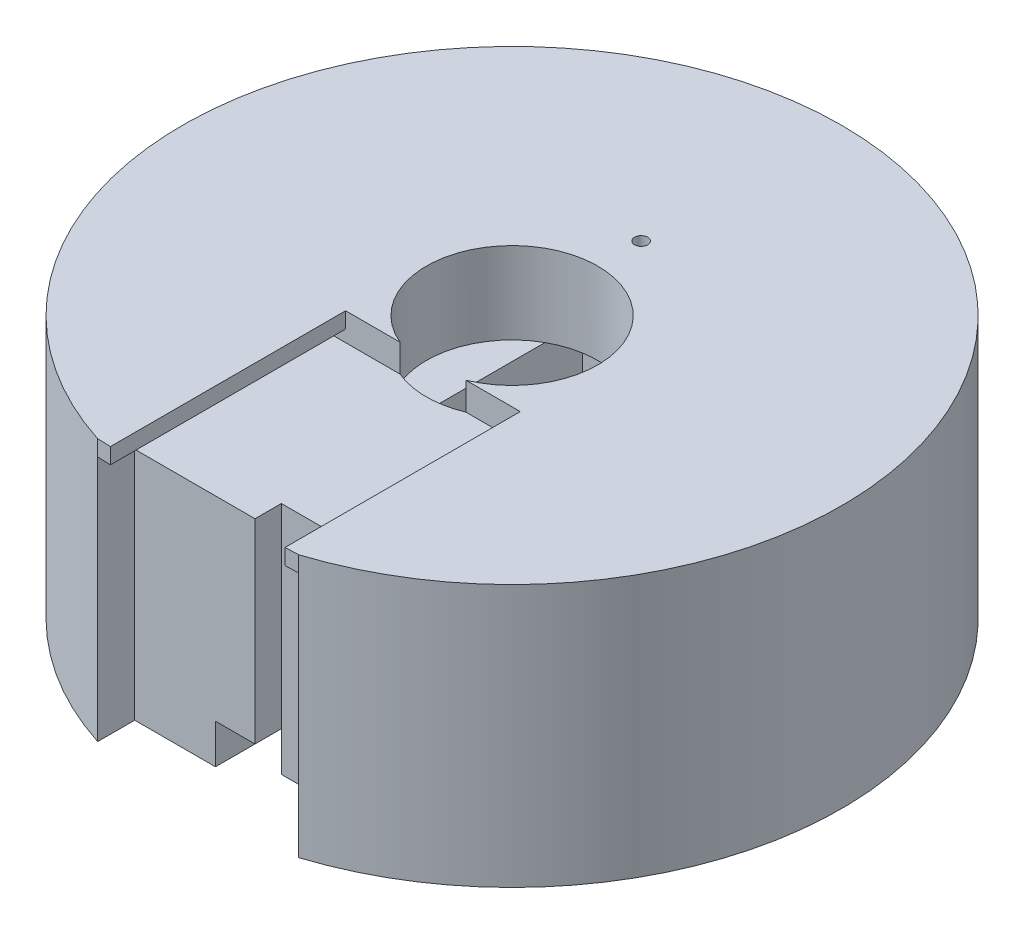
ISO-10303-21;
HEADER;
FILE_DESCRIPTION(('STEP AP214'),'2;1');
FILE_NAME('part.step','',(''),(''),'','','');
FILE_SCHEMA(('AUTOMOTIVE_DESIGN { 1 0 10303 214 1 1 1 1 }'));
ENDSEC;
DATA;
#1=APPLICATION_CONTEXT('core data for automotive mechanical design processes');
#2=APPLICATION_PROTOCOL_DEFINITION('international standard','automotive_design',2000,#1);
#3=PRODUCT_CONTEXT('',#1,'mechanical');
#4=PRODUCT('Part','Part','',(#3));
#5=PRODUCT_RELATED_PRODUCT_CATEGORY('part','',(#4));
#6=PRODUCT_DEFINITION_FORMATION('','',#4);
#7=PRODUCT_DEFINITION_CONTEXT('part definition',#1,'design');
#8=PRODUCT_DEFINITION('design','',#6,#7);
#9=PRODUCT_DEFINITION_SHAPE('','',#8);
#10=(LENGTH_UNIT() NAMED_UNIT(*) SI_UNIT(.MILLI.,.METRE.));
#11=(NAMED_UNIT(*) PLANE_ANGLE_UNIT() SI_UNIT($,.RADIAN.));
#12=(NAMED_UNIT(*) SI_UNIT($,.STERADIAN.) SOLID_ANGLE_UNIT());
#13=UNCERTAINTY_MEASURE_WITH_UNIT(LENGTH_MEASURE(1.E-05),#10,'distance_accuracy_value','');
#14=(GEOMETRIC_REPRESENTATION_CONTEXT(3) GLOBAL_UNCERTAINTY_ASSIGNED_CONTEXT((#13)) GLOBAL_UNIT_ASSIGNED_CONTEXT((#10,
#11,#12)) REPRESENTATION_CONTEXT('',''));
#15=CARTESIAN_POINT('',(0.,0.,0.));
#16=DIRECTION('',(0.,0.,1.));
#17=DIRECTION('',(1.,0.,0.));
#18=AXIS2_PLACEMENT_3D('',#15,#16,#17);
#19=CARTESIAN_POINT('',(15.25,67.1317300508551,50.));
#20=DIRECTION('',(1.,0.,0.));
#21=DIRECTION('',(0.,0.,-1.));
#22=AXIS2_PLACEMENT_3D('',#19,#20,#21);
#23=PLANE('',#22);
#24=DIRECTION('',(0.,0.,1.));
#25=VECTOR('',#24,1.);
#26=CARTESIAN_POINT('',(15.2500000000003,37.4,47.6176175380499));
#27=LINE('',#26,#25);
#28=CARTESIAN_POINT('',(15.25,37.4,12.));
#29=VERTEX_POINT('',#28);
#30=CARTESIAN_POINT('',(15.2500000000003,37.4,47.6176175380499));
#31=VERTEX_POINT('',#30);
#32=EDGE_CURVE('E243',#29,#31,#27,.T.);
#33=ORIENTED_EDGE('',*,*,#32,.F.);
#34=DIRECTION('',(0.,-1.,0.));
#35=VECTOR('',#34,1.);
#36=CARTESIAN_POINT('',(15.25,40.8,12.));
#37=LINE('',#36,#35);
#38=CARTESIAN_POINT('',(15.25,35.6,12.));
#39=VERTEX_POINT('',#38);
#40=EDGE_CURVE('E248',#29,#39,#37,.T.);
#41=ORIENTED_EDGE('',*,*,#40,.T.);
#42=DIRECTION('',(0.,0.,-1.));
#43=VECTOR('',#42,1.);
#44=CARTESIAN_POINT('',(15.25,35.6,0.));
#45=LINE('',#44,#43);
#46=CARTESIAN_POINT('',(15.25,35.6,38.));
#47=VERTEX_POINT('',#46);
#48=EDGE_CURVE('E52',#47,#39,#45,.T.);
#49=ORIENTED_EDGE('',*,*,#48,.F.);
#50=DIRECTION('',(0.,-1.,0.));
#51=VECTOR('',#50,1.);
#52=CARTESIAN_POINT('',(15.25,6.,38.));
#53=LINE('',#52,#51);
#54=CARTESIAN_POINT('',(15.25,0.,38.));
#55=VERTEX_POINT('',#54);
#56=EDGE_CURVE('E333',#47,#55,#53,.T.);
#57=ORIENTED_EDGE('',*,*,#56,.T.);
#58=DIRECTION('',(0.,0.,1.));
#59=VECTOR('',#58,1.);
#60=CARTESIAN_POINT('',(15.25,0.,50.));
#61=LINE('',#60,#59);
#62=CARTESIAN_POINT('',(15.25,0.,47.6176175380499));
#63=VERTEX_POINT('',#62);
#64=EDGE_CURVE('E342',#55,#63,#61,.T.);
#65=ORIENTED_EDGE('',*,*,#64,.T.);
#66=DIRECTION('',(0.,-1.,0.));
#67=VECTOR('',#66,1.);
#68=CARTESIAN_POINT('',(15.25,19.2,47.6176175380499));
#69=LINE('',#68,#67);
#70=EDGE_CURVE('E358',#31,#63,#69,.T.);
#71=ORIENTED_EDGE('',*,*,#70,.F.);
#72=EDGE_LOOP('',(#33,#41,#49,#57,#65,#71));
#73=FACE_BOUND('',#72,.T.);
#74=ADVANCED_FACE('F44',(#73),#23,.F.);
#75=CARTESIAN_POINT('',(-15.25,67.1317300508551,50.));
#76=DIRECTION('',(-1.,0.,0.));
#77=DIRECTION('',(0.,0.,1.));
#78=AXIS2_PLACEMENT_3D('',#75,#76,#77);
#79=PLANE('',#78);
#80=DIRECTION('',(0.,0.,-1.));
#81=VECTOR('',#80,1.);
#82=CARTESIAN_POINT('',(-15.25,37.4,47.6176175380499));
#83=LINE('',#82,#81);
#84=CARTESIAN_POINT('',(-15.25,37.4,47.6176175380499));
#85=VERTEX_POINT('',#84);
#86=CARTESIAN_POINT('',(-15.25,37.4,12.));
#87=VERTEX_POINT('',#86);
#88=EDGE_CURVE('E258',#85,#87,#83,.T.);
#89=ORIENTED_EDGE('',*,*,#88,.F.);
#90=DIRECTION('',(0.,-1.,0.));
#91=VECTOR('',#90,1.);
#92=CARTESIAN_POINT('',(-15.25,19.2,47.6176175380499));
#93=LINE('',#92,#91);
#94=CARTESIAN_POINT('',(-15.25,0.,47.6176175380499));
#95=VERTEX_POINT('',#94);
#96=EDGE_CURVE('E355',#95,#85,#93,.F.);
#97=ORIENTED_EDGE('',*,*,#96,.F.);
#98=DIRECTION('',(0.,0.,-1.));
#99=VECTOR('',#98,1.);
#100=CARTESIAN_POINT('',(-15.25,0.,50.));
#101=LINE('',#100,#99);
#102=CARTESIAN_POINT('',(-15.25,0.,42.));
#103=VERTEX_POINT('',#102);
#104=EDGE_CURVE('E332',#95,#103,#101,.T.);
#105=ORIENTED_EDGE('',*,*,#104,.T.);
#106=DIRECTION('',(0.,-1.,0.));
#107=VECTOR('',#106,1.);
#108=CARTESIAN_POINT('',(-15.25,67.1317300508551,42.));
#109=LINE('',#108,#107);
#110=CARTESIAN_POINT('',(-15.25,35.6,42.));
#111=VERTEX_POINT('',#110);
#112=EDGE_CURVE('E352',#111,#103,#109,.T.);
#113=ORIENTED_EDGE('',*,*,#112,.F.);
#114=DIRECTION('',(0.,0.,-1.));
#115=VECTOR('',#114,1.);
#116=CARTESIAN_POINT('',(-15.25,35.6,0.));
#117=LINE('',#116,#115);
#118=CARTESIAN_POINT('',(-15.25,35.6,12.));
#119=VERTEX_POINT('',#118);
#120=EDGE_CURVE('E283',#111,#119,#117,.T.);
#121=ORIENTED_EDGE('',*,*,#120,.T.);
#122=DIRECTION('',(0.,-1.,0.));
#123=VECTOR('',#122,1.);
#124=CARTESIAN_POINT('',(-15.25,40.8,12.));
#125=LINE('',#124,#123);
#126=EDGE_CURVE('E295',#87,#119,#125,.T.);
#127=ORIENTED_EDGE('',*,*,#126,.F.);
#128=EDGE_LOOP('',(#89,#97,#105,#113,#121,#127));
#129=FACE_BOUND('',#128,.T.);
#130=ADVANCED_FACE('F505',(#129),#79,.F.);
#131=CARTESIAN_POINT('',(0.,19.2,0.));
#132=DIRECTION('',(0.,-1.,0.));
#133=DIRECTION('',(0.,0.,-1.));
#134=AXIS2_PLACEMENT_3D('',#131,#132,#133);
#135=CYLINDRICAL_SURFACE('',#134,50.);
#136=CARTESIAN_POINT('',(0.,39.8,0.));
#137=DIRECTION('',(0.,1.,0.));
#138=DIRECTION('',(0.,0.,1.));
#139=AXIS2_PLACEMENT_3D('',#136,#137,#138);
#140=CIRCLE('',#139,50.);
#141=CARTESIAN_POINT('',(15.25,39.8,47.6176175380499));
#142=VERTEX_POINT('',#141);
#143=CARTESIAN_POINT('',(-15.25,39.8,47.6176175380499));
#144=VERTEX_POINT('',#143);
#145=EDGE_CURVE('E271',#142,#144,#140,.T.);
#146=ORIENTED_EDGE('',*,*,#145,.F.);
#147=EDGE_CURVE('E359',#142,#31,#69,.T.);
#148=ORIENTED_EDGE('',*,*,#147,.T.);
#149=ORIENTED_EDGE('',*,*,#70,.T.);
#150=CARTESIAN_POINT('',(0.,0.,0.));
#151=DIRECTION('',(0.,1.,0.));
#152=DIRECTION('',(0.,0.,1.));
#153=AXIS2_PLACEMENT_3D('',#150,#151,#152);
#154=CIRCLE('',#153,50.);
#155=EDGE_CURVE('E443',#63,#95,#154,.T.);
#156=ORIENTED_EDGE('',*,*,#155,.T.);
#157=ORIENTED_EDGE('',*,*,#96,.T.);
#158=DIRECTION('',(0.,1.,0.));
#159=VECTOR('',#158,1.);
#160=CARTESIAN_POINT('',(-15.25,-0.141589965759817,47.6176175380499));
#161=LINE('',#160,#159);
#162=EDGE_CURVE('E264',#85,#144,#161,.T.);
#163=ORIENTED_EDGE('',*,*,#162,.T.);
#164=EDGE_LOOP('',(#146,#148,#149,#156,#157,#163));
#165=FACE_BOUND('',#164,.T.);
#166=ADVANCED_FACE('F46',(#165),#135,.T.);
#167=CARTESIAN_POINT('',(0.,35.6,0.));
#168=DIRECTION('',(0.,-1.,0.));
#169=DIRECTION('',(0.,0.,-1.));
#170=AXIS2_PLACEMENT_3D('',#167,#168,#169);
#171=CYLINDRICAL_SURFACE('',#170,13.);
#172=CARTESIAN_POINT('',(0.,27.4,0.));
#173=DIRECTION('',(0.,1.,0.));
#174=DIRECTION('',(0.,0.,1.));
#175=AXIS2_PLACEMENT_3D('',#172,#173,#174);
#176=CIRCLE('',#175,13.);
#177=CARTESIAN_POINT('',(6.35,27.4,-11.3436105363328));
#178=VERTEX_POINT('',#177);
#179=CARTESIAN_POINT('',(-6.35,27.4,-11.3436105363328));
#180=VERTEX_POINT('',#179);
#181=EDGE_CURVE('E371',#178,#180,#176,.T.);
#182=ORIENTED_EDGE('',*,*,#181,.F.);
#183=EDGE_CURVE('E286',#180,#178,#176,.T.);
#184=ORIENTED_EDGE('',*,*,#183,.F.);
#185=EDGE_LOOP('',(#182,#184));
#186=FACE_BOUND('',#185,.T.);
#187=DIRECTION('',(0.,-1.,0.));
#188=VECTOR('',#187,1.);
#189=CARTESIAN_POINT('',(5.,40.8,12.));
#190=LINE('',#189,#188);
#191=CARTESIAN_POINT('',(5.,39.8,12.));
#192=VERTEX_POINT('',#191);
#193=CARTESIAN_POINT('',(5.,35.6,12.));
#194=VERTEX_POINT('',#193);
#195=EDGE_CURVE('E291',#192,#194,#190,.T.);
#196=ORIENTED_EDGE('',*,*,#195,.F.);
#197=CARTESIAN_POINT('',(0.,39.8,0.));
#198=DIRECTION('',(0.,1.,0.));
#199=DIRECTION('',(0.,0.,1.));
#200=AXIS2_PLACEMENT_3D('',#197,#198,#199);
#201=CIRCLE('',#200,13.);
#202=CARTESIAN_POINT('',(-5.,39.8,12.));
#203=VERTEX_POINT('',#202);
#204=EDGE_CURVE('E64',#192,#203,#201,.T.);
#205=ORIENTED_EDGE('',*,*,#204,.T.);
#206=DIRECTION('',(0.,-1.,0.));
#207=VECTOR('',#206,1.);
#208=CARTESIAN_POINT('',(-5.,40.8,12.));
#209=LINE('',#208,#207);
#210=CARTESIAN_POINT('',(-5.,35.6,12.));
#211=VERTEX_POINT('',#210);
#212=EDGE_CURVE('E293',#203,#211,#209,.T.);
#213=ORIENTED_EDGE('',*,*,#212,.T.);
#214=CARTESIAN_POINT('',(0.,35.6,0.));
#215=DIRECTION('',(0.,1.,0.));
#216=DIRECTION('',(0.,0.,1.));
#217=AXIS2_PLACEMENT_3D('',#214,#215,#216);
#218=CIRCLE('',#217,13.);
#219=EDGE_CURVE('E372',#211,#194,#218,.T.);
#220=ORIENTED_EDGE('',*,*,#219,.T.);
#221=EDGE_LOOP('',(#196,#205,#213,#220));
#222=FACE_BOUND('',#221,.T.);
#223=ADVANCED_FACE('F528',(#186,#222),#171,.F.);
#224=CARTESIAN_POINT('',(0.,35.6,-19.58));
#225=DIRECTION('',(0.,-1.,0.));
#226=DIRECTION('',(0.,0.,-1.));
#227=AXIS2_PLACEMENT_3D('',#224,#225,#226);
#228=CYLINDRICAL_SURFACE('',#227,1.);
#229=CARTESIAN_POINT('',(0.,19.2,-19.58));
#230=DIRECTION('',(0.,-1.,0.));
#231=DIRECTION('',(0.,0.,-1.));
#232=AXIS2_PLACEMENT_3D('',#229,#230,#231);
#233=CIRCLE('',#232,1.);
#234=CARTESIAN_POINT('',(0.,19.2,-20.58));
#235=VERTEX_POINT('',#234);
#236=EDGE_CURVE('E362',#235,#235,#233,.T.);
#237=ORIENTED_EDGE('',*,*,#236,.T.);
#238=EDGE_LOOP('',(#237));
#239=FACE_BOUND('',#238,.T.);
#240=CARTESIAN_POINT('',(0.,39.8,-19.58));
#241=DIRECTION('',(0.,1.,0.));
#242=DIRECTION('',(0.,0.,1.));
#243=AXIS2_PLACEMENT_3D('',#240,#241,#242);
#244=CIRCLE('',#243,1.);
#245=CARTESIAN_POINT('',(0.,39.8,-18.58));
#246=VERTEX_POINT('',#245);
#247=EDGE_CURVE('E277',#246,#246,#244,.F.);
#248=ORIENTED_EDGE('',*,*,#247,.F.);
#249=EDGE_LOOP('',(#248));
#250=FACE_BOUND('',#249,.T.);
#251=ADVANCED_FACE('F525',(#239,#250),#228,.F.);
#252=CARTESIAN_POINT('',(0.,40.8,12.));
#253=DIRECTION('',(0.,0.,-1.));
#254=DIRECTION('',(-1.,0.,0.));
#255=AXIS2_PLACEMENT_3D('',#252,#253,#254);
#256=PLANE('',#255);
#257=DIRECTION('',(1.,0.,0.));
#258=VECTOR('',#257,1.);
#259=CARTESIAN_POINT('',(0.,39.8,12.));
#260=LINE('',#259,#258);
#261=CARTESIAN_POINT('',(-13.25,39.8,12.));
#262=VERTEX_POINT('',#261);
#263=EDGE_CURVE('E275',#262,#203,#260,.T.);
#264=ORIENTED_EDGE('',*,*,#263,.F.);
#265=DIRECTION('',(0.,1.,0.));
#266=VECTOR('',#265,1.);
#267=CARTESIAN_POINT('',(-13.25,-0.141589965759817,12.));
#268=LINE('',#267,#266);
#269=CARTESIAN_POINT('',(-13.25,37.4,12.));
#270=VERTEX_POINT('',#269);
#271=EDGE_CURVE('E256',#270,#262,#268,.T.);
#272=ORIENTED_EDGE('',*,*,#271,.F.);
#273=DIRECTION('',(1.,0.,0.));
#274=VECTOR('',#273,1.);
#275=CARTESIAN_POINT('',(-15.25,37.4,12.));
#276=LINE('',#275,#274);
#277=EDGE_CURVE('E255',#87,#270,#276,.T.);
#278=ORIENTED_EDGE('',*,*,#277,.F.);
#279=ORIENTED_EDGE('',*,*,#126,.T.);
#280=DIRECTION('',(1.,0.,0.));
#281=VECTOR('',#280,1.);
#282=CARTESIAN_POINT('',(0.,35.6,12.));
#283=LINE('',#282,#281);
#284=EDGE_CURVE('E280',#119,#211,#283,.T.);
#285=ORIENTED_EDGE('',*,*,#284,.T.);
#286=ORIENTED_EDGE('',*,*,#212,.F.);
#287=EDGE_LOOP('',(#264,#272,#278,#279,#285,#286));
#288=FACE_BOUND('',#287,.T.);
#289=ADVANCED_FACE('F527',(#288),#256,.F.);
#290=DIRECTION('',(1.,0.,0.));
#291=VECTOR('',#290,1.);
#292=CARTESIAN_POINT('',(15.25,37.4,12.));
#293=LINE('',#292,#291);
#294=CARTESIAN_POINT('',(13.25,37.4,12.));
#295=VERTEX_POINT('',#294);
#296=EDGE_CURVE('E229',#295,#29,#293,.T.);
#297=ORIENTED_EDGE('',*,*,#296,.F.);
#298=DIRECTION('',(0.,1.,0.));
#299=VECTOR('',#298,1.);
#300=CARTESIAN_POINT('',(13.25,-0.141589965759817,12.));
#301=LINE('',#300,#299);
#302=CARTESIAN_POINT('',(13.25,39.8,12.));
#303=VERTEX_POINT('',#302);
#304=EDGE_CURVE('E237',#295,#303,#301,.T.);
#305=ORIENTED_EDGE('',*,*,#304,.T.);
#306=DIRECTION('',(1.,0.,0.));
#307=VECTOR('',#306,1.);
#308=CARTESIAN_POINT('',(0.,39.8,12.));
#309=LINE('',#308,#307);
#310=EDGE_CURVE('E13',#192,#303,#309,.T.);
#311=ORIENTED_EDGE('',*,*,#310,.F.);
#312=ORIENTED_EDGE('',*,*,#195,.T.);
#313=EDGE_CURVE('E289',#194,#39,#283,.T.);
#314=ORIENTED_EDGE('',*,*,#313,.T.);
#315=ORIENTED_EDGE('',*,*,#40,.F.);
#316=EDGE_LOOP('',(#297,#305,#311,#312,#314,#315));
#317=FACE_BOUND('',#316,.T.);
#318=ADVANCED_FACE('F246',(#317),#256,.F.);
#319=CARTESIAN_POINT('',(0.,35.6,0.));
#320=DIRECTION('',(0.,1.,0.));
#321=DIRECTION('',(0.,0.,1.));
#322=AXIS2_PLACEMENT_3D('',#319,#320,#321);
#323=PLANE('',#322);
#324=DIRECTION('',(1.,0.,0.));
#325=VECTOR('',#324,1.);
#326=CARTESIAN_POINT('',(15.25,35.6,38.));
#327=LINE('',#326,#325);
#328=CARTESIAN_POINT('',(3.00000000000001,35.6,38.));
#329=VERTEX_POINT('',#328);
#330=EDGE_CURVE('E301',#329,#47,#327,.T.);
#331=ORIENTED_EDGE('',*,*,#330,.T.);
#332=ORIENTED_EDGE('',*,*,#48,.T.);
#333=ORIENTED_EDGE('',*,*,#313,.F.);
#334=ORIENTED_EDGE('',*,*,#219,.F.);
#335=ORIENTED_EDGE('',*,*,#284,.F.);
#336=ORIENTED_EDGE('',*,*,#120,.F.);
#337=DIRECTION('',(1.,0.,0.));
#338=VECTOR('',#337,1.);
#339=CARTESIAN_POINT('',(-15.25,35.6,42.));
#340=LINE('',#339,#338);
#341=CARTESIAN_POINT('',(3.00000000000001,35.6,42.));
#342=VERTEX_POINT('',#341);
#343=EDGE_CURVE('E345',#111,#342,#340,.T.);
#344=ORIENTED_EDGE('',*,*,#343,.T.);
#345=DIRECTION('',(0.,0.,-1.));
#346=VECTOR('',#345,1.);
#347=CARTESIAN_POINT('',(3.00000000000001,35.6,42.));
#348=LINE('',#347,#346);
#349=EDGE_CURVE('E306',#342,#329,#348,.T.);
#350=ORIENTED_EDGE('',*,*,#349,.T.);
#351=EDGE_LOOP('',(#331,#332,#333,#334,#335,#336,#344,#350));
#352=FACE_BOUND('',#351,.T.);
#353=ADVANCED_FACE('F532',(#352),#323,.T.);
#354=CARTESIAN_POINT('',(0.,27.4,0.));
#355=DIRECTION('',(0.,1.,0.));
#356=DIRECTION('',(0.,0.,1.));
#357=AXIS2_PLACEMENT_3D('',#354,#355,#356);
#358=PLANE('',#357);
#359=CARTESIAN_POINT('',(0.,27.4,8.67));
#360=DIRECTION('',(0.,1.,0.));
#361=DIRECTION('',(0.,0.,1.));
#362=AXIS2_PLACEMENT_3D('',#359,#360,#361);
#363=CIRCLE('',#362,1.);
#364=CARTESIAN_POINT('',(0.,27.4,9.67));
#365=VERTEX_POINT('',#364);
#366=EDGE_CURVE('E366',#365,#365,#363,.T.);
#367=ORIENTED_EDGE('',*,*,#366,.F.);
#368=EDGE_LOOP('',(#367));
#369=FACE_BOUND('',#368,.T.);
#370=DIRECTION('',(0.,0.,1.));
#371=VECTOR('',#370,1.);
#372=CARTESIAN_POINT('',(-6.35,27.4,-17.055));
#373=LINE('',#372,#371);
#374=CARTESIAN_POINT('',(-6.35,27.4,6.145));
#375=VERTEX_POINT('',#374);
#376=EDGE_CURVE('E385',#180,#375,#373,.T.);
#377=ORIENTED_EDGE('',*,*,#376,.F.);
#378=ORIENTED_EDGE('',*,*,#183,.T.);
#379=DIRECTION('',(0.,0.,-1.));
#380=VECTOR('',#379,1.);
#381=CARTESIAN_POINT('',(6.35,27.4,-17.055));
#382=LINE('',#381,#380);
#383=CARTESIAN_POINT('',(6.35,27.4,6.145));
#384=VERTEX_POINT('',#383);
#385=EDGE_CURVE('E378',#384,#178,#382,.T.);
#386=ORIENTED_EDGE('',*,*,#385,.F.);
#387=DIRECTION('',(1.,0.,0.));
#388=VECTOR('',#387,1.);
#389=CARTESIAN_POINT('',(-6.35,27.4,6.145));
#390=LINE('',#389,#388);
#391=EDGE_CURVE('E389',#375,#384,#390,.T.);
#392=ORIENTED_EDGE('',*,*,#391,.F.);
#393=EDGE_LOOP('',(#377,#378,#386,#392));
#394=FACE_BOUND('',#393,.T.);
#395=ADVANCED_FACE('F451',(#369,#394),#358,.T.);
#396=CARTESIAN_POINT('',(0.,0.,0.));
#397=DIRECTION('',(0.,1.,0.));
#398=DIRECTION('',(0.,0.,1.));
#399=AXIS2_PLACEMENT_3D('',#396,#397,#398);
#400=PLANE('',#399);
#401=DIRECTION('',(1.,0.,0.));
#402=VECTOR('',#401,1.);
#403=CARTESIAN_POINT('',(-6.35,0.,11.07));
#404=LINE('',#403,#402);
#405=CARTESIAN_POINT('',(-6.35,0.,11.07));
#406=VERTEX_POINT('',#405);
#407=CARTESIAN_POINT('',(-3.00000000000001,0.,11.07));
#408=VERTEX_POINT('',#407);
#409=EDGE_CURVE('E429',#406,#408,#404,.T.);
#410=ORIENTED_EDGE('',*,*,#409,.T.);
#411=DIRECTION('',(0.,0.,-1.));
#412=VECTOR('',#411,1.);
#413=CARTESIAN_POINT('',(-3.00000000000001,0.,11.07));
#414=LINE('',#413,#412);
#415=CARTESIAN_POINT('',(-3.00000000000001,0.,42.));
#416=VERTEX_POINT('',#415);
#417=EDGE_CURVE('E304',#416,#408,#414,.T.);
#418=ORIENTED_EDGE('',*,*,#417,.F.);
#419=DIRECTION('',(1.,0.,0.));
#420=VECTOR('',#419,1.);
#421=CARTESIAN_POINT('',(-15.25,0.,42.));
#422=LINE('',#421,#420);
#423=EDGE_CURVE('E346',#103,#416,#422,.T.);
#424=ORIENTED_EDGE('',*,*,#423,.F.);
#425=ORIENTED_EDGE('',*,*,#104,.F.);
#426=ORIENTED_EDGE('',*,*,#155,.F.);
#427=ORIENTED_EDGE('',*,*,#64,.F.);
#428=DIRECTION('',(1.,0.,0.));
#429=VECTOR('',#428,1.);
#430=CARTESIAN_POINT('',(3.00000000000001,0.,38.));
#431=LINE('',#430,#429);
#432=CARTESIAN_POINT('',(3.00000000000001,0.,38.));
#433=VERTEX_POINT('',#432);
#434=EDGE_CURVE('E315',#433,#55,#431,.T.);
#435=ORIENTED_EDGE('',*,*,#434,.F.);
#436=DIRECTION('',(0.,0.,1.));
#437=VECTOR('',#436,1.);
#438=CARTESIAN_POINT('',(3.00000000000001,0.,11.07));
#439=LINE('',#438,#437);
#440=CARTESIAN_POINT('',(3.00000000000001,0.,11.07));
#441=VERTEX_POINT('',#440);
#442=EDGE_CURVE('E325',#441,#433,#439,.T.);
#443=ORIENTED_EDGE('',*,*,#442,.F.);
#444=CARTESIAN_POINT('',(6.35,0.,11.07));
#445=VERTEX_POINT('',#444);
#446=EDGE_CURVE('E428',#441,#445,#404,.T.);
#447=ORIENTED_EDGE('',*,*,#446,.T.);
#448=DIRECTION('',(0.,0.,-1.));
#449=VECTOR('',#448,1.);
#450=CARTESIAN_POINT('',(6.35,0.,-21.98));
#451=LINE('',#450,#449);
#452=CARTESIAN_POINT('',(6.35,0.,-21.98));
#453=VERTEX_POINT('',#452);
#454=EDGE_CURVE('E411',#445,#453,#451,.T.);
#455=ORIENTED_EDGE('',*,*,#454,.T.);
#456=DIRECTION('',(-1.,0.,0.));
#457=VECTOR('',#456,1.);
#458=CARTESIAN_POINT('',(-6.35,0.,-21.98));
#459=LINE('',#458,#457);
#460=CARTESIAN_POINT('',(-6.35,0.,-21.98));
#461=VERTEX_POINT('',#460);
#462=EDGE_CURVE('E406',#453,#461,#459,.T.);
#463=ORIENTED_EDGE('',*,*,#462,.T.);
#464=DIRECTION('',(0.,0.,1.));
#465=VECTOR('',#464,1.);
#466=CARTESIAN_POINT('',(-6.35,0.,-21.98));
#467=LINE('',#466,#465);
#468=EDGE_CURVE('E425',#461,#406,#467,.T.);
#469=ORIENTED_EDGE('',*,*,#468,.T.);
#470=EDGE_LOOP('',(#410,#418,#424,#425,#426,#427,#435,#443,#447,#455,#463,#469));
#471=FACE_BOUND('',#470,.T.);
#472=ADVANCED_FACE('F485',(#471),#400,.F.);
#473=CARTESIAN_POINT('',(-6.35,19.2,-21.98));
#474=DIRECTION('',(0.,0.,1.));
#475=DIRECTION('',(1.,0.,0.));
#476=AXIS2_PLACEMENT_3D('',#473,#474,#475);
#477=PLANE('',#476);
#478=ORIENTED_EDGE('',*,*,#462,.F.);
#479=DIRECTION('',(0.,-1.,0.));
#480=VECTOR('',#479,1.);
#481=CARTESIAN_POINT('',(6.35,19.2,-21.98));
#482=LINE('',#481,#480);
#483=CARTESIAN_POINT('',(6.35,19.2,-21.98));
#484=VERTEX_POINT('',#483);
#485=EDGE_CURVE('E422',#484,#453,#482,.T.);
#486=ORIENTED_EDGE('',*,*,#485,.F.);
#487=DIRECTION('',(-1.,0.,0.));
#488=VECTOR('',#487,1.);
#489=CARTESIAN_POINT('',(-6.35,19.2,-21.98));
#490=LINE('',#489,#488);
#491=CARTESIAN_POINT('',(-6.35,19.2,-21.98));
#492=VERTEX_POINT('',#491);
#493=EDGE_CURVE('E407',#484,#492,#490,.T.);
#494=ORIENTED_EDGE('',*,*,#493,.T.);
#495=DIRECTION('',(0.,-1.,0.));
#496=VECTOR('',#495,1.);
#497=CARTESIAN_POINT('',(-6.35,19.2,-21.98));
#498=LINE('',#497,#496);
#499=EDGE_CURVE('E441',#492,#461,#498,.T.);
#500=ORIENTED_EDGE('',*,*,#499,.T.);
#501=EDGE_LOOP('',(#478,#486,#494,#500));
#502=FACE_BOUND('',#501,.T.);
#503=ADVANCED_FACE('F482',(#502),#477,.T.);
#504=CARTESIAN_POINT('',(-6.35,19.2,-21.98));
#505=DIRECTION('',(1.,0.,0.));
#506=DIRECTION('',(0.,0.,-1.));
#507=AXIS2_PLACEMENT_3D('',#504,#505,#506);
#508=PLANE('',#507);
#509=ORIENTED_EDGE('',*,*,#468,.F.);
#510=ORIENTED_EDGE('',*,*,#499,.F.);
#511=DIRECTION('',(0.,0.,1.));
#512=VECTOR('',#511,1.);
#513=CARTESIAN_POINT('',(-6.35,19.2,-21.98));
#514=LINE('',#513,#512);
#515=CARTESIAN_POINT('',(-6.35,19.2,-17.055));
#516=VERTEX_POINT('',#515);
#517=EDGE_CURVE('E412',#492,#516,#514,.T.);
#518=ORIENTED_EDGE('',*,*,#517,.T.);
#519=DIRECTION('',(0.,-1.,0.));
#520=VECTOR('',#519,1.);
#521=CARTESIAN_POINT('',(-6.35,27.4,-17.055));
#522=LINE('',#521,#520);
#523=CARTESIAN_POINT('',(-6.35,27.4,-17.055));
#524=VERTEX_POINT('',#523);
#525=EDGE_CURVE('E401',#524,#516,#522,.T.);
#526=ORIENTED_EDGE('',*,*,#525,.F.);
#527=EDGE_CURVE('E386',#524,#180,#373,.T.);
#528=ORIENTED_EDGE('',*,*,#527,.T.);
#529=ORIENTED_EDGE('',*,*,#376,.T.);
#530=DIRECTION('',(0.,-1.,0.));
#531=VECTOR('',#530,1.);
#532=CARTESIAN_POINT('',(-6.35,27.4,6.145));
#533=LINE('',#532,#531);
#534=CARTESIAN_POINT('',(-6.35,19.2,6.145));
#535=VERTEX_POINT('',#534);
#536=EDGE_CURVE('E398',#375,#535,#533,.T.);
#537=ORIENTED_EDGE('',*,*,#536,.T.);
#538=CARTESIAN_POINT('',(-6.35,19.2,11.07));
#539=VERTEX_POINT('',#538);
#540=EDGE_CURVE('E410',#535,#539,#514,.T.);
#541=ORIENTED_EDGE('',*,*,#540,.T.);
#542=DIRECTION('',(0.,-1.,0.));
#543=VECTOR('',#542,1.);
#544=CARTESIAN_POINT('',(-6.35,19.2,11.07));
#545=LINE('',#544,#543);
#546=EDGE_CURVE('E439',#539,#406,#545,.T.);
#547=ORIENTED_EDGE('',*,*,#546,.T.);
#548=EDGE_LOOP('',(#509,#510,#518,#526,#528,#529,#537,#541,#547));
#549=FACE_BOUND('',#548,.T.);
#550=ADVANCED_FACE('F471',(#549),#508,.T.);
#551=CARTESIAN_POINT('',(-6.35,19.2,11.07));
#552=DIRECTION('',(0.,0.,-1.));
#553=DIRECTION('',(-1.,0.,0.));
#554=AXIS2_PLACEMENT_3D('',#551,#552,#553);
#555=PLANE('',#554);
#556=DIRECTION('',(0.,-1.,0.));
#557=VECTOR('',#556,1.);
#558=CARTESIAN_POINT('',(-3.00000000000001,6.,11.07));
#559=LINE('',#558,#557);
#560=CARTESIAN_POINT('',(-3.00000000000001,6.,11.07));
#561=VERTEX_POINT('',#560);
#562=EDGE_CURVE('E323',#561,#408,#559,.T.);
#563=ORIENTED_EDGE('',*,*,#562,.T.);
#564=ORIENTED_EDGE('',*,*,#409,.F.);
#565=ORIENTED_EDGE('',*,*,#546,.F.);
#566=DIRECTION('',(1.,0.,0.));
#567=VECTOR('',#566,1.);
#568=CARTESIAN_POINT('',(-6.35,19.2,11.07));
#569=LINE('',#568,#567);
#570=CARTESIAN_POINT('',(6.35,19.2,11.07));
#571=VERTEX_POINT('',#570);
#572=EDGE_CURVE('E415',#539,#571,#569,.T.);
#573=ORIENTED_EDGE('',*,*,#572,.T.);
#574=DIRECTION('',(0.,-1.,0.));
#575=VECTOR('',#574,1.);
#576=CARTESIAN_POINT('',(6.35,19.2,11.07));
#577=LINE('',#576,#575);
#578=EDGE_CURVE('E436',#571,#445,#577,.T.);
#579=ORIENTED_EDGE('',*,*,#578,.T.);
#580=ORIENTED_EDGE('',*,*,#446,.F.);
#581=DIRECTION('',(0.,-1.,0.));
#582=VECTOR('',#581,1.);
#583=CARTESIAN_POINT('',(3.00000000000001,6.,11.07));
#584=LINE('',#583,#582);
#585=CARTESIAN_POINT('',(3.00000000000001,6.,11.07));
#586=VERTEX_POINT('',#585);
#587=EDGE_CURVE('E338',#586,#441,#584,.T.);
#588=ORIENTED_EDGE('',*,*,#587,.F.);
#589=DIRECTION('',(1.,0.,0.));
#590=VECTOR('',#589,1.);
#591=CARTESIAN_POINT('',(-3.00000000000001,6.,11.07));
#592=LINE('',#591,#590);
#593=EDGE_CURVE('E314',#561,#586,#592,.T.);
#594=ORIENTED_EDGE('',*,*,#593,.F.);
#595=EDGE_LOOP('',(#563,#564,#565,#573,#579,#580,#588,#594));
#596=FACE_BOUND('',#595,.T.);
#597=ADVANCED_FACE('F489',(#596),#555,.T.);
#598=CARTESIAN_POINT('',(6.35,19.2,-21.98));
#599=DIRECTION('',(-1.,0.,0.));
#600=DIRECTION('',(0.,0.,1.));
#601=AXIS2_PLACEMENT_3D('',#598,#599,#600);
#602=PLANE('',#601);
#603=ORIENTED_EDGE('',*,*,#454,.F.);
#604=ORIENTED_EDGE('',*,*,#578,.F.);
#605=DIRECTION('',(0.,0.,-1.));
#606=VECTOR('',#605,1.);
#607=CARTESIAN_POINT('',(6.35,19.2,-21.98));
#608=LINE('',#607,#606);
#609=CARTESIAN_POINT('',(6.35,19.2,6.145));
#610=VERTEX_POINT('',#609);
#611=EDGE_CURVE('E419',#571,#610,#608,.T.);
#612=ORIENTED_EDGE('',*,*,#611,.T.);
#613=DIRECTION('',(0.,-1.,0.));
#614=VECTOR('',#613,1.);
#615=CARTESIAN_POINT('',(6.35,27.4,6.145));
#616=LINE('',#615,#614);
#617=EDGE_CURVE('E391',#384,#610,#616,.T.);
#618=ORIENTED_EDGE('',*,*,#617,.F.);
#619=ORIENTED_EDGE('',*,*,#385,.T.);
#620=CARTESIAN_POINT('',(6.35,27.4,-17.055));
#621=VERTEX_POINT('',#620);
#622=EDGE_CURVE('E382',#178,#621,#382,.T.);
#623=ORIENTED_EDGE('',*,*,#622,.T.);
#624=DIRECTION('',(0.,-1.,0.));
#625=VECTOR('',#624,1.);
#626=CARTESIAN_POINT('',(6.35,27.4,-17.055));
#627=LINE('',#626,#625);
#628=CARTESIAN_POINT('',(6.35,19.2,-17.055));
#629=VERTEX_POINT('',#628);
#630=EDGE_CURVE('E403',#621,#629,#627,.T.);
#631=ORIENTED_EDGE('',*,*,#630,.T.);
#632=EDGE_CURVE('E418',#629,#484,#608,.T.);
#633=ORIENTED_EDGE('',*,*,#632,.T.);
#634=ORIENTED_EDGE('',*,*,#485,.T.);
#635=EDGE_LOOP('',(#603,#604,#612,#618,#619,#623,#631,#633,#634));
#636=FACE_BOUND('',#635,.T.);
#637=ADVANCED_FACE('F458',(#636),#602,.T.);
#638=CARTESIAN_POINT('',(0.,19.2,0.));
#639=DIRECTION('',(0.,1.,0.));
#640=DIRECTION('',(0.,0.,1.));
#641=AXIS2_PLACEMENT_3D('',#638,#639,#640);
#642=PLANE('',#641);
#643=ORIENTED_EDGE('',*,*,#236,.F.);
#644=EDGE_LOOP('',(#643));
#645=FACE_BOUND('',#644,.T.);
#646=ORIENTED_EDGE('',*,*,#517,.F.);
#647=ORIENTED_EDGE('',*,*,#493,.F.);
#648=ORIENTED_EDGE('',*,*,#632,.F.);
#649=DIRECTION('',(-1.,0.,0.));
#650=VECTOR('',#649,1.);
#651=CARTESIAN_POINT('',(-6.35,19.2,-17.055));
#652=LINE('',#651,#650);
#653=EDGE_CURVE('E375',#629,#516,#652,.T.);
#654=ORIENTED_EDGE('',*,*,#653,.T.);
#655=EDGE_LOOP('',(#646,#647,#648,#654));
#656=FACE_BOUND('',#655,.T.);
#657=ADVANCED_FACE('F491',(#645,#656),#642,.F.);
#658=CARTESIAN_POINT('',(0.,19.2,8.67));
#659=DIRECTION('',(0.,-1.,0.));
#660=DIRECTION('',(0.,0.,-1.));
#661=AXIS2_PLACEMENT_3D('',#658,#659,#660);
#662=CIRCLE('',#661,1.);
#663=CARTESIAN_POINT('',(0.,19.2,7.67));
#664=VERTEX_POINT('',#663);
#665=EDGE_CURVE('E363',#664,#664,#662,.T.);
#666=ORIENTED_EDGE('',*,*,#665,.F.);
#667=EDGE_LOOP('',(#666));
#668=FACE_BOUND('',#667,.T.);
#669=ORIENTED_EDGE('',*,*,#540,.F.);
#670=DIRECTION('',(1.,0.,0.));
#671=VECTOR('',#670,1.);
#672=CARTESIAN_POINT('',(-6.35,19.2,6.145));
#673=LINE('',#672,#671);
#674=EDGE_CURVE('E394',#535,#610,#673,.T.);
#675=ORIENTED_EDGE('',*,*,#674,.T.);
#676=ORIENTED_EDGE('',*,*,#611,.F.);
#677=ORIENTED_EDGE('',*,*,#572,.F.);
#678=EDGE_LOOP('',(#669,#675,#676,#677));
#679=FACE_BOUND('',#678,.T.);
#680=ADVANCED_FACE('F467',(#668,#679),#642,.F.);
#681=CARTESIAN_POINT('',(-6.35,27.4,-17.055));
#682=DIRECTION('',(0.,0.,1.));
#683=DIRECTION('',(1.,0.,0.));
#684=AXIS2_PLACEMENT_3D('',#681,#682,#683);
#685=PLANE('',#684);
#686=ORIENTED_EDGE('',*,*,#653,.F.);
#687=ORIENTED_EDGE('',*,*,#630,.F.);
#688=DIRECTION('',(-1.,0.,0.));
#689=VECTOR('',#688,1.);
#690=CARTESIAN_POINT('',(-6.35,27.4,-17.055));
#691=LINE('',#690,#689);
#692=EDGE_CURVE('E381',#621,#524,#691,.T.);
#693=ORIENTED_EDGE('',*,*,#692,.T.);
#694=ORIENTED_EDGE('',*,*,#525,.T.);
#695=EDGE_LOOP('',(#686,#687,#693,#694));
#696=FACE_BOUND('',#695,.T.);
#697=ADVANCED_FACE('F477',(#696),#685,.T.);
#698=CARTESIAN_POINT('',(-6.35,27.4,6.145));
#699=DIRECTION('',(0.,0.,-1.));
#700=DIRECTION('',(-1.,0.,0.));
#701=AXIS2_PLACEMENT_3D('',#698,#699,#700);
#702=PLANE('',#701);
#703=ORIENTED_EDGE('',*,*,#674,.F.);
#704=ORIENTED_EDGE('',*,*,#536,.F.);
#705=ORIENTED_EDGE('',*,*,#391,.T.);
#706=ORIENTED_EDGE('',*,*,#617,.T.);
#707=EDGE_LOOP('',(#703,#704,#705,#706));
#708=FACE_BOUND('',#707,.T.);
#709=ADVANCED_FACE('F464',(#708),#702,.T.);
#710=CARTESIAN_POINT('',(0.,27.4,0.));
#711=DIRECTION('',(0.,1.,0.));
#712=DIRECTION('',(0.,0.,1.));
#713=AXIS2_PLACEMENT_3D('',#710,#711,#712);
#714=PLANE('',#713);
#715=ORIENTED_EDGE('',*,*,#622,.F.);
#716=ORIENTED_EDGE('',*,*,#181,.T.);
#717=ORIENTED_EDGE('',*,*,#527,.F.);
#718=ORIENTED_EDGE('',*,*,#692,.F.);
#719=EDGE_LOOP('',(#715,#716,#717,#718));
#720=FACE_BOUND('',#719,.T.);
#721=ADVANCED_FACE('F474',(#720),#714,.F.);
#722=CARTESIAN_POINT('',(0.,35.6,8.67));
#723=DIRECTION('',(0.,-1.,0.));
#724=DIRECTION('',(0.,0.,-1.));
#725=AXIS2_PLACEMENT_3D('',#722,#723,#724);
#726=CYLINDRICAL_SURFACE('',#725,1.);
#727=ORIENTED_EDGE('',*,*,#366,.T.);
#728=EDGE_LOOP('',(#727));
#729=FACE_BOUND('',#728,.T.);
#730=ORIENTED_EDGE('',*,*,#665,.T.);
#731=EDGE_LOOP('',(#730));
#732=FACE_BOUND('',#731,.T.);
#733=ADVANCED_FACE('F520',(#729,#732),#726,.F.);
#734=CARTESIAN_POINT('',(-15.25,67.1317300508551,42.));
#735=DIRECTION('',(0.,0.,-1.));
#736=DIRECTION('',(-1.,0.,0.));
#737=AXIS2_PLACEMENT_3D('',#734,#735,#736);
#738=PLANE('',#737);
#739=DIRECTION('',(-1.,0.,0.));
#740=VECTOR('',#739,1.);
#741=CARTESIAN_POINT('',(3.00000000000001,6.,42.));
#742=LINE('',#741,#740);
#743=CARTESIAN_POINT('',(3.00000000000001,6.,42.));
#744=VERTEX_POINT('',#743);
#745=CARTESIAN_POINT('',(-3.00000000000001,6.,42.));
#746=VERTEX_POINT('',#745);
#747=EDGE_CURVE('E321',#744,#746,#742,.T.);
#748=ORIENTED_EDGE('',*,*,#747,.F.);
#749=DIRECTION('',(0.,-1.,0.));
#750=VECTOR('',#749,1.);
#751=CARTESIAN_POINT('',(3.00000000000001,48.4865239688599,42.));
#752=LINE('',#751,#750);
#753=EDGE_CURVE('E300',#342,#744,#752,.T.);
#754=ORIENTED_EDGE('',*,*,#753,.F.);
#755=ORIENTED_EDGE('',*,*,#343,.F.);
#756=ORIENTED_EDGE('',*,*,#112,.T.);
#757=ORIENTED_EDGE('',*,*,#423,.T.);
#758=DIRECTION('',(0.,-1.,0.));
#759=VECTOR('',#758,1.);
#760=CARTESIAN_POINT('',(-3.00000000000001,6.,42.));
#761=LINE('',#760,#759);
#762=EDGE_CURVE('E330',#746,#416,#761,.T.);
#763=ORIENTED_EDGE('',*,*,#762,.F.);
#764=EDGE_LOOP('',(#748,#754,#755,#756,#757,#763));
#765=FACE_BOUND('',#764,.T.);
#766=ADVANCED_FACE('F516',(#765),#738,.F.);
#767=CARTESIAN_POINT('',(-3.00000000000001,6.,11.07));
#768=DIRECTION('',(-1.,0.,0.));
#769=DIRECTION('',(0.,0.,1.));
#770=AXIS2_PLACEMENT_3D('',#767,#768,#769);
#771=PLANE('',#770);
#772=ORIENTED_EDGE('',*,*,#417,.T.);
#773=ORIENTED_EDGE('',*,*,#562,.F.);
#774=DIRECTION('',(0.,0.,-1.));
#775=VECTOR('',#774,1.);
#776=CARTESIAN_POINT('',(-3.00000000000001,6.,11.07));
#777=LINE('',#776,#775);
#778=EDGE_CURVE('E311',#746,#561,#777,.T.);
#779=ORIENTED_EDGE('',*,*,#778,.F.);
#780=ORIENTED_EDGE('',*,*,#762,.T.);
#781=EDGE_LOOP('',(#772,#773,#779,#780));
#782=FACE_BOUND('',#781,.T.);
#783=ADVANCED_FACE('F519',(#782),#771,.F.);
#784=CARTESIAN_POINT('',(3.00000000000001,6.,38.));
#785=DIRECTION('',(0.,0.,-1.));
#786=DIRECTION('',(-1.,0.,0.));
#787=AXIS2_PLACEMENT_3D('',#784,#785,#786);
#788=PLANE('',#787);
#789=ORIENTED_EDGE('',*,*,#434,.T.);
#790=ORIENTED_EDGE('',*,*,#56,.F.);
#791=ORIENTED_EDGE('',*,*,#330,.F.);
#792=DIRECTION('',(0.,-1.,0.));
#793=VECTOR('',#792,1.);
#794=CARTESIAN_POINT('',(3.00000000000001,48.4865239688599,38.));
#795=LINE('',#794,#793);
#796=CARTESIAN_POINT('',(3.00000000000001,6.,38.));
#797=VERTEX_POINT('',#796);
#798=EDGE_CURVE('E305',#329,#797,#795,.T.);
#799=ORIENTED_EDGE('',*,*,#798,.T.);
#800=DIRECTION('',(0.,-1.,0.));
#801=VECTOR('',#800,1.);
#802=CARTESIAN_POINT('',(3.00000000000001,6.,38.));
#803=LINE('',#802,#801);
#804=EDGE_CURVE('E336',#797,#433,#803,.T.);
#805=ORIENTED_EDGE('',*,*,#804,.T.);
#806=EDGE_LOOP('',(#789,#790,#791,#799,#805));
#807=FACE_BOUND('',#806,.T.);
#808=ADVANCED_FACE('F567',(#807),#788,.F.);
#809=CARTESIAN_POINT('',(3.00000000000001,6.,11.07));
#810=DIRECTION('',(1.,0.,0.));
#811=DIRECTION('',(0.,0.,-1.));
#812=AXIS2_PLACEMENT_3D('',#809,#810,#811);
#813=PLANE('',#812);
#814=ORIENTED_EDGE('',*,*,#442,.T.);
#815=ORIENTED_EDGE('',*,*,#804,.F.);
#816=DIRECTION('',(0.,0.,1.));
#817=VECTOR('',#816,1.);
#818=CARTESIAN_POINT('',(3.00000000000001,6.,11.07));
#819=LINE('',#818,#817);
#820=EDGE_CURVE('E318',#586,#797,#819,.T.);
#821=ORIENTED_EDGE('',*,*,#820,.F.);
#822=ORIENTED_EDGE('',*,*,#587,.T.);
#823=EDGE_LOOP('',(#814,#815,#821,#822));
#824=FACE_BOUND('',#823,.T.);
#825=ADVANCED_FACE('F574',(#824),#813,.F.);
#826=CARTESIAN_POINT('',(0.,6.,0.));
#827=DIRECTION('',(0.,1.,0.));
#828=DIRECTION('',(0.,0.,1.));
#829=AXIS2_PLACEMENT_3D('',#826,#827,#828);
#830=PLANE('',#829);
#831=ORIENTED_EDGE('',*,*,#820,.T.);
#832=DIRECTION('',(0.,0.,-1.));
#833=VECTOR('',#832,1.);
#834=CARTESIAN_POINT('',(3.00000000000001,6.,42.));
#835=LINE('',#834,#833);
#836=EDGE_CURVE('E297',#744,#797,#835,.T.);
#837=ORIENTED_EDGE('',*,*,#836,.F.);
#838=ORIENTED_EDGE('',*,*,#747,.T.);
#839=ORIENTED_EDGE('',*,*,#778,.T.);
#840=ORIENTED_EDGE('',*,*,#593,.T.);
#841=EDGE_LOOP('',(#831,#837,#838,#839,#840));
#842=FACE_BOUND('',#841,.T.);
#843=ADVANCED_FACE('F578',(#842),#830,.F.);
#844=CARTESIAN_POINT('',(3.00000000000001,48.4865239688599,42.));
#845=DIRECTION('',(-1.,0.,0.));
#846=DIRECTION('',(0.,0.,1.));
#847=AXIS2_PLACEMENT_3D('',#844,#845,#846);
#848=PLANE('',#847);
#849=ORIENTED_EDGE('',*,*,#753,.T.);
#850=ORIENTED_EDGE('',*,*,#836,.T.);
#851=ORIENTED_EDGE('',*,*,#798,.F.);
#852=ORIENTED_EDGE('',*,*,#349,.F.);
#853=EDGE_LOOP('',(#849,#850,#851,#852));
#854=FACE_BOUND('',#853,.T.);
#855=ADVANCED_FACE('F587',(#854),#848,.F.);
#856=CARTESIAN_POINT('',(0.,39.8,0.));
#857=DIRECTION('',(0.,1.,0.));
#858=DIRECTION('',(0.,0.,1.));
#859=AXIS2_PLACEMENT_3D('',#856,#857,#858);
#860=PLANE('',#859);
#861=ORIENTED_EDGE('',*,*,#310,.T.);
#862=DIRECTION('',(0.,0.,1.));
#863=VECTOR('',#862,1.);
#864=CARTESIAN_POINT('',(13.25,39.8,12.));
#865=LINE('',#864,#863);
#866=CARTESIAN_POINT('',(13.2500000000003,39.8,47.6855888739488));
#867=VERTEX_POINT('',#866);
#868=EDGE_CURVE('E240',#303,#867,#865,.T.);
#869=ORIENTED_EDGE('',*,*,#868,.T.);
#870=DIRECTION('',(0.999422986987543,0.,-0.0339660577768125));
#871=VECTOR('',#870,1.);
#872=CARTESIAN_POINT('',(13.2500000000003,39.8,47.6855888739488));
#873=LINE('',#872,#871);
#874=EDGE_CURVE('E762',#867,#142,#873,.T.);
#875=ORIENTED_EDGE('',*,*,#874,.T.);
#876=ORIENTED_EDGE('',*,*,#145,.T.);
#877=DIRECTION('',(0.999422986987543,0.,0.0339660577768125));
#878=VECTOR('',#877,1.);
#879=CARTESIAN_POINT('',(-13.25,39.8,47.6855888739488));
#880=LINE('',#879,#878);
#881=CARTESIAN_POINT('',(-13.25,39.8,47.6855888739488));
#882=VERTEX_POINT('',#881);
#883=EDGE_CURVE('E261',#144,#882,#880,.T.);
#884=ORIENTED_EDGE('',*,*,#883,.T.);
#885=DIRECTION('',(0.,0.,-1.));
#886=VECTOR('',#885,1.);
#887=CARTESIAN_POINT('',(-13.25,39.8,12.));
#888=LINE('',#887,#886);
#889=EDGE_CURVE('E59',#882,#262,#888,.T.);
#890=ORIENTED_EDGE('',*,*,#889,.T.);
#891=ORIENTED_EDGE('',*,*,#263,.T.);
#892=ORIENTED_EDGE('',*,*,#204,.F.);
#893=EDGE_LOOP('',(#861,#869,#875,#876,#884,#890,#891,#892));
#894=FACE_BOUND('',#893,.T.);
#895=ORIENTED_EDGE('',*,*,#247,.T.);
#896=EDGE_LOOP('',(#895));
#897=FACE_BOUND('',#896,.T.);
#898=ADVANCED_FACE('F596',(#894,#897),#860,.T.);
#899=CARTESIAN_POINT('',(-13.25,-0.141589965759817,12.));
#900=DIRECTION('',(1.,0.,0.));
#901=DIRECTION('',(0.,0.,-1.));
#902=AXIS2_PLACEMENT_3D('',#899,#900,#901);
#903=PLANE('',#902);
#904=DIRECTION('',(0.,0.,1.));
#905=VECTOR('',#904,1.);
#906=CARTESIAN_POINT('',(-13.25,37.4,12.));
#907=LINE('',#906,#905);
#908=CARTESIAN_POINT('',(-13.25,37.4,47.6855888739488));
#909=VERTEX_POINT('',#908);
#910=EDGE_CURVE('E253',#270,#909,#907,.T.);
#911=ORIENTED_EDGE('',*,*,#910,.F.);
#912=ORIENTED_EDGE('',*,*,#271,.T.);
#913=ORIENTED_EDGE('',*,*,#889,.F.);
#914=DIRECTION('',(0.,1.,0.));
#915=VECTOR('',#914,1.);
#916=CARTESIAN_POINT('',(-13.25,-0.141589965759817,47.6855888739488));
#917=LINE('',#916,#915);
#918=EDGE_CURVE('E266',#909,#882,#917,.T.);
#919=ORIENTED_EDGE('',*,*,#918,.F.);
#920=EDGE_LOOP('',(#911,#912,#913,#919));
#921=FACE_BOUND('',#920,.T.);
#922=ADVANCED_FACE('F651',(#921),#903,.T.);
#923=CARTESIAN_POINT('',(-13.25,-0.141589965759817,47.6855888739488));
#924=DIRECTION('',(-0.0339660577768125,0.,0.999422986987543));
#925=DIRECTION('',(0.999422986987543,0.,0.0339660577768125));
#926=AXIS2_PLACEMENT_3D('',#923,#924,#925);
#927=PLANE('',#926);
#928=DIRECTION('',(-0.999422986987543,0.,-0.0339660577768125));
#929=VECTOR('',#928,1.);
#930=CARTESIAN_POINT('',(-13.25,37.4,47.6855888739488));
#931=LINE('',#930,#929);
#932=EDGE_CURVE('E260',#909,#85,#931,.T.);
#933=ORIENTED_EDGE('',*,*,#932,.F.);
#934=ORIENTED_EDGE('',*,*,#918,.T.);
#935=ORIENTED_EDGE('',*,*,#883,.F.);
#936=ORIENTED_EDGE('',*,*,#162,.F.);
#937=EDGE_LOOP('',(#933,#934,#935,#936));
#938=FACE_BOUND('',#937,.T.);
#939=ADVANCED_FACE('F659',(#938),#927,.T.);
#940=CARTESIAN_POINT('',(0.,37.4,0.));
#941=DIRECTION('',(0.,1.,0.));
#942=DIRECTION('',(0.,0.,1.));
#943=AXIS2_PLACEMENT_3D('',#940,#941,#942);
#944=PLANE('',#943);
#945=ORIENTED_EDGE('',*,*,#88,.T.);
#946=ORIENTED_EDGE('',*,*,#277,.T.);
#947=ORIENTED_EDGE('',*,*,#910,.T.);
#948=ORIENTED_EDGE('',*,*,#932,.T.);
#949=EDGE_LOOP('',(#945,#946,#947,#948));
#950=FACE_BOUND('',#949,.T.);
#951=ADVANCED_FACE('F668',(#950),#944,.F.);
#952=CARTESIAN_POINT('',(13.25,-0.141589965759817,12.));
#953=DIRECTION('',(-1.,0.,0.));
#954=DIRECTION('',(0.,0.,1.));
#955=AXIS2_PLACEMENT_3D('',#952,#953,#954);
#956=PLANE('',#955);
#957=DIRECTION('',(0.,0.,-1.));
#958=VECTOR('',#957,1.);
#959=CARTESIAN_POINT('',(13.25,37.4,12.));
#960=LINE('',#959,#958);
#961=CARTESIAN_POINT('',(13.2500000000003,37.4,47.6855888739488));
#962=VERTEX_POINT('',#961);
#963=EDGE_CURVE('E225',#962,#295,#960,.T.);
#964=ORIENTED_EDGE('',*,*,#963,.F.);
#965=DIRECTION('',(0.,1.,0.));
#966=VECTOR('',#965,1.);
#967=CARTESIAN_POINT('',(13.2500000000003,-0.141589965759817,47.6855888739488));
#968=LINE('',#967,#966);
#969=EDGE_CURVE('E242',#962,#867,#968,.T.);
#970=ORIENTED_EDGE('',*,*,#969,.T.);
#971=ORIENTED_EDGE('',*,*,#868,.F.);
#972=ORIENTED_EDGE('',*,*,#304,.F.);
#973=EDGE_LOOP('',(#964,#970,#971,#972));
#974=FACE_BOUND('',#973,.T.);
#975=ADVANCED_FACE('F238',(#974),#956,.T.);
#976=CARTESIAN_POINT('',(13.2500000000003,-0.141589965759817,47.6855888739488));
#977=DIRECTION('',(0.0339660577768125,0.,0.999422986987543));
#978=DIRECTION('',(0.999422986987543,0.,-0.0339660577768125));
#979=AXIS2_PLACEMENT_3D('',#976,#977,#978);
#980=PLANE('',#979);
#981=DIRECTION('',(-0.999422986987543,0.,0.0339660577768125));
#982=VECTOR('',#981,1.);
#983=CARTESIAN_POINT('',(13.2500000000003,37.4,47.6855888739488));
#984=LINE('',#983,#982);
#985=EDGE_CURVE('E232',#31,#962,#984,.T.);
#986=ORIENTED_EDGE('',*,*,#985,.F.);
#987=ORIENTED_EDGE('',*,*,#147,.F.);
#988=ORIENTED_EDGE('',*,*,#874,.F.);
#989=ORIENTED_EDGE('',*,*,#969,.F.);
#990=EDGE_LOOP('',(#986,#987,#988,#989));
#991=FACE_BOUND('',#990,.T.);
#992=ADVANCED_FACE('F685',(#991),#980,.T.);
#993=CARTESIAN_POINT('',(0.,37.4,0.));
#994=DIRECTION('',(0.,1.,0.));
#995=DIRECTION('',(0.,0.,1.));
#996=AXIS2_PLACEMENT_3D('',#993,#994,#995);
#997=PLANE('',#996);
#998=ORIENTED_EDGE('',*,*,#963,.T.);
#999=ORIENTED_EDGE('',*,*,#296,.T.);
#1000=ORIENTED_EDGE('',*,*,#32,.T.);
#1001=ORIENTED_EDGE('',*,*,#985,.T.);
#1002=EDGE_LOOP('',(#998,#999,#1000,#1001));
#1003=FACE_BOUND('',#1002,.T.);
#1004=ADVANCED_FACE('F227',(#1003),#997,.F.);
#1005=CLOSED_SHELL('',(#74,#130,#166,#223,#251,#289,#318,#353,#395,#472,#503,#550,#597,#637,
#657,#680,#697,#709,#721,#733,#766,#783,#808,#825,#843,#855,#898,#922,#939,#951,#975,#992,#1004));
#1006=MANIFOLD_SOLID_BREP('B2',#1005);
#1007=ADVANCED_BREP_SHAPE_REPRESENTATION('',(#18,#1006),#14);
#1008=SHAPE_DEFINITION_REPRESENTATION(#9,#1007);
ENDSEC;
END-ISO-10303-21;
